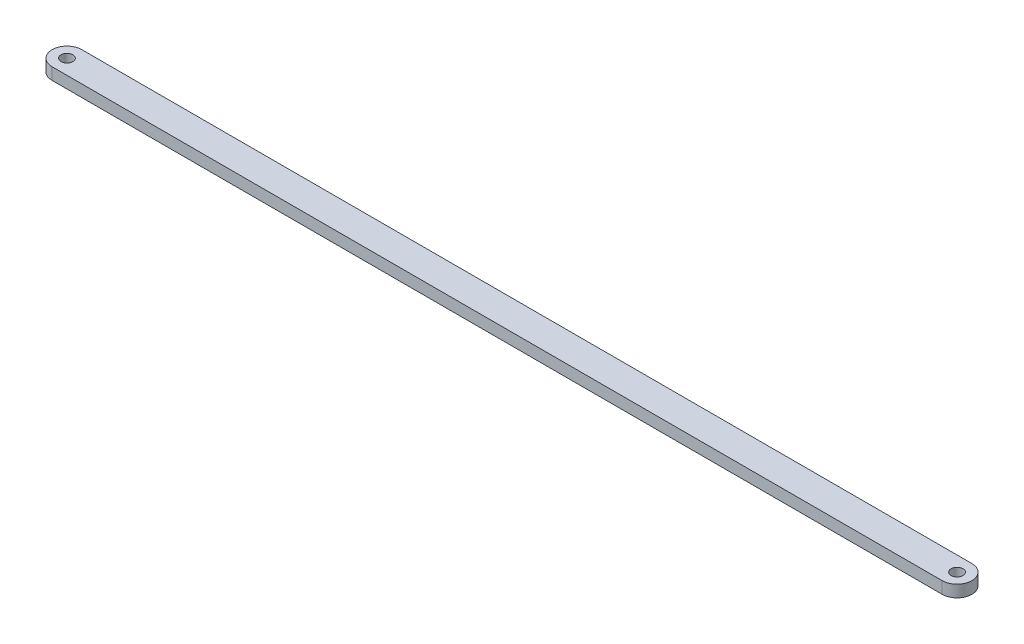
ISO-10303-21;
HEADER;
FILE_DESCRIPTION(('STEP AP214'),'2;1');
FILE_NAME('part.step','',(''),(''),'','','');
FILE_SCHEMA(('AUTOMOTIVE_DESIGN { 1 0 10303 214 1 1 1 1 }'));
ENDSEC;
DATA;
#1=APPLICATION_CONTEXT('core data for automotive mechanical design processes');
#2=APPLICATION_PROTOCOL_DEFINITION('international standard','automotive_design',2000,#1);
#3=PRODUCT_CONTEXT('',#1,'mechanical');
#4=PRODUCT('Part','Part','',(#3));
#5=PRODUCT_RELATED_PRODUCT_CATEGORY('part','',(#4));
#6=PRODUCT_DEFINITION_FORMATION('','',#4);
#7=PRODUCT_DEFINITION_CONTEXT('part definition',#1,'design');
#8=PRODUCT_DEFINITION('design','',#6,#7);
#9=PRODUCT_DEFINITION_SHAPE('','',#8);
#10=(LENGTH_UNIT() NAMED_UNIT(*) SI_UNIT(.MILLI.,.METRE.));
#11=(NAMED_UNIT(*) PLANE_ANGLE_UNIT() SI_UNIT($,.RADIAN.));
#12=(NAMED_UNIT(*) SI_UNIT($,.STERADIAN.) SOLID_ANGLE_UNIT());
#13=UNCERTAINTY_MEASURE_WITH_UNIT(LENGTH_MEASURE(1.E-05),#10,'distance_accuracy_value','');
#14=(GEOMETRIC_REPRESENTATION_CONTEXT(3) GLOBAL_UNCERTAINTY_ASSIGNED_CONTEXT((#13)) GLOBAL_UNIT_ASSIGNED_CONTEXT((#10,
#11,#12)) REPRESENTATION_CONTEXT('',''));
#15=CARTESIAN_POINT('',(0.,0.,0.));
#16=DIRECTION('',(0.,0.,1.));
#17=DIRECTION('',(1.,0.,0.));
#18=AXIS2_PLACEMENT_3D('',#15,#16,#17);
#19=CARTESIAN_POINT('',(-10.,2.,0.));
#20=DIRECTION('',(0.,1.,0.));
#21=DIRECTION('',(0.,0.,1.));
#22=AXIS2_PLACEMENT_3D('',#19,#20,#21);
#23=PLANE('',#22);
#24=CARTESIAN_POINT('',(140.,2.,0.));
#25=DIRECTION('',(0.,1.,0.));
#26=DIRECTION('',(0.,0.,1.));
#27=AXIS2_PLACEMENT_3D('',#24,#25,#26);
#28=CIRCLE('',#27,0.999999999999998);
#29=CARTESIAN_POINT('',(140.,2.,0.999999999999998));
#30=VERTEX_POINT('',#29);
#31=EDGE_CURVE('E104',#30,#30,#28,.T.);
#32=ORIENTED_EDGE('',*,*,#31,.F.);
#33=EDGE_LOOP('',(#32));
#34=FACE_BOUND('',#33,.T.);
#35=CARTESIAN_POINT('',(-10.,2.,0.));
#36=DIRECTION('',(0.,1.,0.));
#37=DIRECTION('',(0.,0.,1.));
#38=AXIS2_PLACEMENT_3D('',#35,#36,#37);
#39=CIRCLE('',#38,2.5);
#40=CARTESIAN_POINT('',(-10.,2.,-2.5));
#41=VERTEX_POINT('',#40);
#42=CARTESIAN_POINT('',(-10.,2.,2.5));
#43=VERTEX_POINT('',#42);
#44=EDGE_CURVE('E89',#41,#43,#39,.T.);
#45=ORIENTED_EDGE('',*,*,#44,.T.);
#46=DIRECTION('',(1.,0.,0.));
#47=VECTOR('',#46,1.);
#48=CARTESIAN_POINT('',(-10.,2.,2.5));
#49=LINE('',#48,#47);
#50=CARTESIAN_POINT('',(140.,2.,2.5));
#51=VERTEX_POINT('',#50);
#52=EDGE_CURVE('E84',#43,#51,#49,.T.);
#53=ORIENTED_EDGE('',*,*,#52,.T.);
#54=CARTESIAN_POINT('',(140.,2.,0.));
#55=DIRECTION('',(0.,1.,0.));
#56=DIRECTION('',(0.,0.,1.));
#57=AXIS2_PLACEMENT_3D('',#54,#55,#56);
#58=CIRCLE('',#57,2.5);
#59=CARTESIAN_POINT('',(140.,2.,-2.5));
#60=VERTEX_POINT('',#59);
#61=EDGE_CURVE('E87',#51,#60,#58,.T.);
#62=ORIENTED_EDGE('',*,*,#61,.T.);
#63=DIRECTION('',(-1.,0.,0.));
#64=VECTOR('',#63,1.);
#65=CARTESIAN_POINT('',(-10.,2.,-2.5));
#66=LINE('',#65,#64);
#67=EDGE_CURVE('E54',#60,#41,#66,.T.);
#68=ORIENTED_EDGE('',*,*,#67,.T.);
#69=EDGE_LOOP('',(#45,#53,#62,#68));
#70=FACE_BOUND('',#69,.T.);
#71=CARTESIAN_POINT('',(-10.,2.,0.));
#72=DIRECTION('',(0.,1.,0.));
#73=DIRECTION('',(0.,0.,1.));
#74=AXIS2_PLACEMENT_3D('',#71,#72,#73);
#75=CIRCLE('',#74,1.);
#76=CARTESIAN_POINT('',(-10.,2.,1.));
#77=VERTEX_POINT('',#76);
#78=EDGE_CURVE('E119',#77,#77,#75,.T.);
#79=ORIENTED_EDGE('',*,*,#78,.F.);
#80=EDGE_LOOP('',(#79));
#81=FACE_BOUND('',#80,.T.);
#82=ADVANCED_FACE('F37',(#34,#70,#81),#23,.T.);
#83=CARTESIAN_POINT('',(-10.,0.,0.));
#84=DIRECTION('',(0.,1.,0.));
#85=DIRECTION('',(0.,0.,1.));
#86=AXIS2_PLACEMENT_3D('',#83,#84,#85);
#87=PLANE('',#86);
#88=CARTESIAN_POINT('',(-10.,0.,0.));
#89=DIRECTION('',(0.,1.,0.));
#90=DIRECTION('',(0.,0.,1.));
#91=AXIS2_PLACEMENT_3D('',#88,#89,#90);
#92=CIRCLE('',#91,2.5);
#93=CARTESIAN_POINT('',(-10.,0.,-2.5));
#94=VERTEX_POINT('',#93);
#95=CARTESIAN_POINT('',(-10.,0.,2.5));
#96=VERTEX_POINT('',#95);
#97=EDGE_CURVE('E101',#94,#96,#92,.T.);
#98=ORIENTED_EDGE('',*,*,#97,.F.);
#99=DIRECTION('',(-1.,0.,0.));
#100=VECTOR('',#99,1.);
#101=CARTESIAN_POINT('',(-10.,0.,-2.5));
#102=LINE('',#101,#100);
#103=CARTESIAN_POINT('',(140.,0.,-2.5));
#104=VERTEX_POINT('',#103);
#105=EDGE_CURVE('E77',#104,#94,#102,.T.);
#106=ORIENTED_EDGE('',*,*,#105,.F.);
#107=CARTESIAN_POINT('',(140.,0.,0.));
#108=DIRECTION('',(0.,1.,0.));
#109=DIRECTION('',(0.,0.,1.));
#110=AXIS2_PLACEMENT_3D('',#107,#108,#109);
#111=CIRCLE('',#110,2.5);
#112=CARTESIAN_POINT('',(140.,0.,2.5));
#113=VERTEX_POINT('',#112);
#114=EDGE_CURVE('E71',#113,#104,#111,.T.);
#115=ORIENTED_EDGE('',*,*,#114,.F.);
#116=DIRECTION('',(1.,0.,0.));
#117=VECTOR('',#116,1.);
#118=CARTESIAN_POINT('',(-10.,0.,2.5));
#119=LINE('',#118,#117);
#120=EDGE_CURVE('E93',#96,#113,#119,.T.);
#121=ORIENTED_EDGE('',*,*,#120,.F.);
#122=EDGE_LOOP('',(#98,#106,#115,#121));
#123=FACE_BOUND('',#122,.T.);
#124=CARTESIAN_POINT('',(140.,0.,0.));
#125=DIRECTION('',(0.,1.,0.));
#126=DIRECTION('',(0.,0.,1.));
#127=AXIS2_PLACEMENT_3D('',#124,#125,#126);
#128=CIRCLE('',#127,0.999999999999998);
#129=CARTESIAN_POINT('',(140.,0.,0.999999999999998));
#130=VERTEX_POINT('',#129);
#131=EDGE_CURVE('E116',#130,#130,#128,.T.);
#132=ORIENTED_EDGE('',*,*,#131,.T.);
#133=EDGE_LOOP('',(#132));
#134=FACE_BOUND('',#133,.T.);
#135=CARTESIAN_POINT('',(-10.,0.,0.));
#136=DIRECTION('',(0.,1.,0.));
#137=DIRECTION('',(0.,0.,1.));
#138=AXIS2_PLACEMENT_3D('',#135,#136,#137);
#139=CIRCLE('',#138,1.);
#140=CARTESIAN_POINT('',(-10.,0.,1.));
#141=VERTEX_POINT('',#140);
#142=EDGE_CURVE('E122',#141,#141,#139,.T.);
#143=ORIENTED_EDGE('',*,*,#142,.T.);
#144=EDGE_LOOP('',(#143));
#145=FACE_BOUND('',#144,.T.);
#146=ADVANCED_FACE('F112',(#123,#134,#145),#87,.F.);
#147=CARTESIAN_POINT('',(-10.,2.,0.));
#148=DIRECTION('',(0.,-1.,0.));
#149=DIRECTION('',(0.,0.,-1.));
#150=AXIS2_PLACEMENT_3D('',#147,#148,#149);
#151=CYLINDRICAL_SURFACE('',#150,2.5);
#152=ORIENTED_EDGE('',*,*,#97,.T.);
#153=DIRECTION('',(0.,-1.,0.));
#154=VECTOR('',#153,1.);
#155=CARTESIAN_POINT('',(-10.,2.,2.5));
#156=LINE('',#155,#154);
#157=EDGE_CURVE('E11',#43,#96,#156,.T.);
#158=ORIENTED_EDGE('',*,*,#157,.F.);
#159=ORIENTED_EDGE('',*,*,#44,.F.);
#160=DIRECTION('',(0.,-1.,0.));
#161=VECTOR('',#160,1.);
#162=CARTESIAN_POINT('',(-10.,2.,-2.5));
#163=LINE('',#162,#161);
#164=EDGE_CURVE('E97',#41,#94,#163,.T.);
#165=ORIENTED_EDGE('',*,*,#164,.T.);
#166=EDGE_LOOP('',(#152,#158,#159,#165));
#167=FACE_BOUND('',#166,.T.);
#168=ADVANCED_FACE('F39',(#167),#151,.T.);
#169=CARTESIAN_POINT('',(-10.,2.,2.5));
#170=DIRECTION('',(0.,0.,-1.));
#171=DIRECTION('',(-1.,0.,0.));
#172=AXIS2_PLACEMENT_3D('',#169,#170,#171);
#173=PLANE('',#172);
#174=ORIENTED_EDGE('',*,*,#120,.T.);
#175=DIRECTION('',(0.,-1.,0.));
#176=VECTOR('',#175,1.);
#177=CARTESIAN_POINT('',(140.,2.,2.5));
#178=LINE('',#177,#176);
#179=EDGE_CURVE('E46',#51,#113,#178,.T.);
#180=ORIENTED_EDGE('',*,*,#179,.F.);
#181=ORIENTED_EDGE('',*,*,#52,.F.);
#182=ORIENTED_EDGE('',*,*,#157,.T.);
#183=EDGE_LOOP('',(#174,#180,#181,#182));
#184=FACE_BOUND('',#183,.T.);
#185=ADVANCED_FACE('F92',(#184),#173,.F.);
#186=CARTESIAN_POINT('',(140.,2.,0.));
#187=DIRECTION('',(0.,-1.,0.));
#188=DIRECTION('',(0.,0.,-1.));
#189=AXIS2_PLACEMENT_3D('',#186,#187,#188);
#190=CYLINDRICAL_SURFACE('',#189,2.5);
#191=ORIENTED_EDGE('',*,*,#114,.T.);
#192=DIRECTION('',(0.,-1.,0.));
#193=VECTOR('',#192,1.);
#194=CARTESIAN_POINT('',(140.,2.,-2.5));
#195=LINE('',#194,#193);
#196=EDGE_CURVE('E94',#60,#104,#195,.T.);
#197=ORIENTED_EDGE('',*,*,#196,.F.);
#198=ORIENTED_EDGE('',*,*,#61,.F.);
#199=ORIENTED_EDGE('',*,*,#179,.T.);
#200=EDGE_LOOP('',(#191,#197,#198,#199));
#201=FACE_BOUND('',#200,.T.);
#202=ADVANCED_FACE('F95',(#201),#190,.T.);
#203=CARTESIAN_POINT('',(-10.,2.,-2.5));
#204=DIRECTION('',(0.,0.,1.));
#205=DIRECTION('',(1.,0.,0.));
#206=AXIS2_PLACEMENT_3D('',#203,#204,#205);
#207=PLANE('',#206);
#208=ORIENTED_EDGE('',*,*,#105,.T.);
#209=ORIENTED_EDGE('',*,*,#164,.F.);
#210=ORIENTED_EDGE('',*,*,#67,.F.);
#211=ORIENTED_EDGE('',*,*,#196,.T.);
#212=EDGE_LOOP('',(#208,#209,#210,#211));
#213=FACE_BOUND('',#212,.T.);
#214=ADVANCED_FACE('F109',(#213),#207,.F.);
#215=CARTESIAN_POINT('',(140.,2.,0.));
#216=DIRECTION('',(0.,-1.,0.));
#217=DIRECTION('',(0.,0.,-1.));
#218=AXIS2_PLACEMENT_3D('',#215,#216,#217);
#219=CYLINDRICAL_SURFACE('',#218,0.999999999999998);
#220=ORIENTED_EDGE('',*,*,#31,.T.);
#221=EDGE_LOOP('',(#220));
#222=FACE_BOUND('',#221,.T.);
#223=ORIENTED_EDGE('',*,*,#131,.F.);
#224=EDGE_LOOP('',(#223));
#225=FACE_BOUND('',#224,.T.);
#226=ADVANCED_FACE('F139',(#222,#225),#219,.F.);
#227=CARTESIAN_POINT('',(-10.,2.,0.));
#228=DIRECTION('',(0.,-1.,0.));
#229=DIRECTION('',(0.,0.,-1.));
#230=AXIS2_PLACEMENT_3D('',#227,#228,#229);
#231=CYLINDRICAL_SURFACE('',#230,1.);
#232=ORIENTED_EDGE('',*,*,#78,.T.);
#233=EDGE_LOOP('',(#232));
#234=FACE_BOUND('',#233,.T.);
#235=ORIENTED_EDGE('',*,*,#142,.F.);
#236=EDGE_LOOP('',(#235));
#237=FACE_BOUND('',#236,.T.);
#238=ADVANCED_FACE('F128',(#234,#237),#231,.F.);
#239=CLOSED_SHELL('',(#82,#146,#168,#185,#202,#214,#226,#238));
#240=MANIFOLD_SOLID_BREP('B2',#239);
#241=ADVANCED_BREP_SHAPE_REPRESENTATION('',(#18,#240),#14);
#242=SHAPE_DEFINITION_REPRESENTATION(#9,#241);
ENDSEC;
END-ISO-10303-21;
